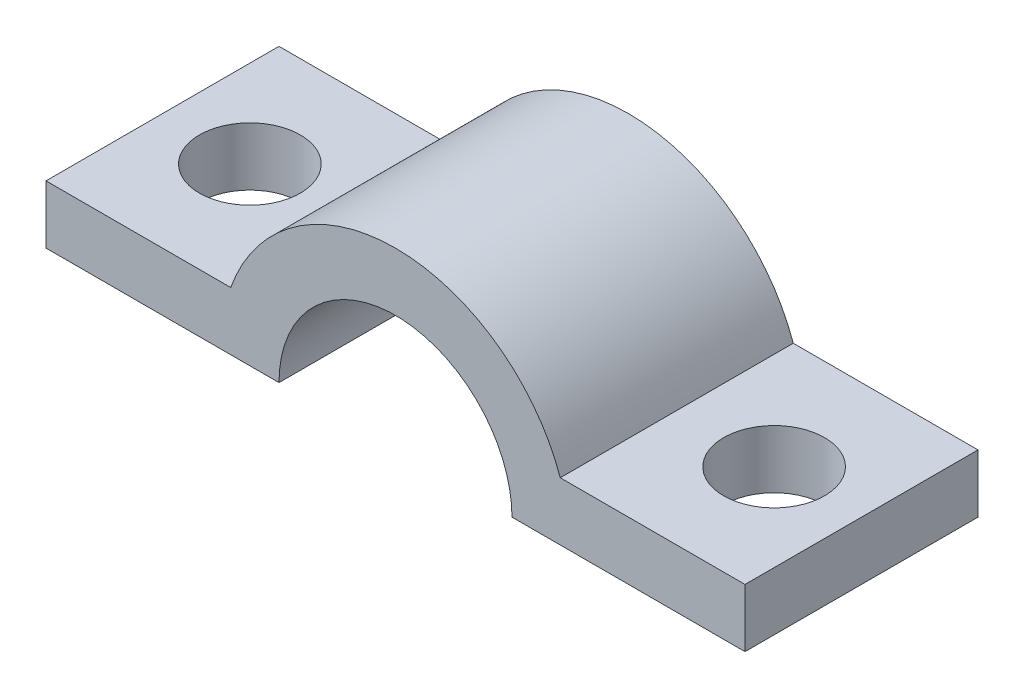
ISO-10303-21;
HEADER;
FILE_DESCRIPTION(('STEP AP214'),'2;1');
FILE_NAME('part.step','',(''),(''),'','','');
FILE_SCHEMA(('AUTOMOTIVE_DESIGN { 1 0 10303 214 1 1 1 1 }'));
ENDSEC;
DATA;
#1=APPLICATION_CONTEXT('core data for automotive mechanical design processes');
#2=APPLICATION_PROTOCOL_DEFINITION('international standard','automotive_design',2000,#1);
#3=PRODUCT_CONTEXT('',#1,'mechanical');
#4=PRODUCT('Part','Part','',(#3));
#5=PRODUCT_RELATED_PRODUCT_CATEGORY('part','',(#4));
#6=PRODUCT_DEFINITION_FORMATION('','',#4);
#7=PRODUCT_DEFINITION_CONTEXT('part definition',#1,'design');
#8=PRODUCT_DEFINITION('design','',#6,#7);
#9=PRODUCT_DEFINITION_SHAPE('','',#8);
#10=(LENGTH_UNIT() NAMED_UNIT(*) SI_UNIT(.MILLI.,.METRE.));
#11=(NAMED_UNIT(*) PLANE_ANGLE_UNIT() SI_UNIT($,.RADIAN.));
#12=(NAMED_UNIT(*) SI_UNIT($,.STERADIAN.) SOLID_ANGLE_UNIT());
#13=UNCERTAINTY_MEASURE_WITH_UNIT(LENGTH_MEASURE(1.E-05),#10,'distance_accuracy_value','');
#14=(GEOMETRIC_REPRESENTATION_CONTEXT(3) GLOBAL_UNCERTAINTY_ASSIGNED_CONTEXT((#13)) GLOBAL_UNIT_ASSIGNED_CONTEXT((#10,
#11,#12)) REPRESENTATION_CONTEXT('',''));
#15=CARTESIAN_POINT('',(0.,0.,0.));
#16=DIRECTION('',(0.,0.,1.));
#17=DIRECTION('',(1.,0.,0.));
#18=AXIS2_PLACEMENT_3D('',#15,#16,#17);
#19=CARTESIAN_POINT('',(0.,0.,12.7));
#20=DIRECTION('',(1.,0.,0.));
#21=DIRECTION('',(0.,0.,-1.));
#22=AXIS2_PLACEMENT_3D('',#19,#20,#21);
#23=PLANE('',#22);
#24=DIRECTION('',(0.,-1.,0.));
#25=VECTOR('',#24,1.);
#26=CARTESIAN_POINT('',(0.,0.,0.));
#27=LINE('',#26,#25);
#28=CARTESIAN_POINT('',(0.,3.175,0.));
#29=VERTEX_POINT('',#28);
#30=CARTESIAN_POINT('',(0.,0.,0.));
#31=VERTEX_POINT('',#30);
#32=EDGE_CURVE('E129',#29,#31,#27,.T.);
#33=ORIENTED_EDGE('',*,*,#32,.T.);
#34=DIRECTION('',(0.,0.,-1.));
#35=VECTOR('',#34,1.);
#36=CARTESIAN_POINT('',(0.,0.,12.7));
#37=LINE('',#36,#35);
#38=CARTESIAN_POINT('',(0.,0.,12.7));
#39=VERTEX_POINT('',#38);
#40=EDGE_CURVE('E11',#39,#31,#37,.T.);
#41=ORIENTED_EDGE('',*,*,#40,.F.);
#42=DIRECTION('',(0.,-1.,0.));
#43=VECTOR('',#42,1.);
#44=CARTESIAN_POINT('',(0.,0.,12.7));
#45=LINE('',#44,#43);
#46=CARTESIAN_POINT('',(0.,3.175,12.7));
#47=VERTEX_POINT('',#46);
#48=EDGE_CURVE('E144',#47,#39,#45,.T.);
#49=ORIENTED_EDGE('',*,*,#48,.F.);
#50=DIRECTION('',(0.,0.,-1.));
#51=VECTOR('',#50,1.);
#52=CARTESIAN_POINT('',(0.,3.175,12.7));
#53=LINE('',#52,#51);
#54=EDGE_CURVE('E125',#47,#29,#53,.T.);
#55=ORIENTED_EDGE('',*,*,#54,.T.);
#56=EDGE_LOOP('',(#33,#41,#49,#55));
#57=FACE_BOUND('',#56,.T.);
#58=ADVANCED_FACE('F33',(#57),#23,.F.);
#59=CARTESIAN_POINT('',(0.,0.,12.7));
#60=DIRECTION('',(0.,1.,0.));
#61=DIRECTION('',(0.,0.,1.));
#62=AXIS2_PLACEMENT_3D('',#59,#60,#61);
#63=PLANE('',#62);
#64=CARTESIAN_POINT('',(4.7625,0.,6.35));
#65=DIRECTION('',(0.,1.,0.));
#66=DIRECTION('',(0.,0.,1.));
#67=AXIS2_PLACEMENT_3D('',#64,#65,#66);
#68=CIRCLE('',#67,2.74999999999999);
#69=CARTESIAN_POINT('',(4.7625,0.,9.09999999999999));
#70=VERTEX_POINT('',#69);
#71=EDGE_CURVE('E182',#70,#70,#68,.T.);
#72=ORIENTED_EDGE('',*,*,#71,.T.);
#73=EDGE_LOOP('',(#72));
#74=FACE_BOUND('',#73,.T.);
#75=DIRECTION('',(1.,0.,0.));
#76=VECTOR('',#75,1.);
#77=CARTESIAN_POINT('',(0.,0.,0.));
#78=LINE('',#77,#76);
#79=CARTESIAN_POINT('',(12.7,0.,0.));
#80=VERTEX_POINT('',#79);
#81=EDGE_CURVE('E132',#31,#80,#78,.T.);
#82=ORIENTED_EDGE('',*,*,#81,.T.);
#83=DIRECTION('',(0.,0.,-1.));
#84=VECTOR('',#83,1.);
#85=CARTESIAN_POINT('',(12.7,0.,12.7));
#86=LINE('',#85,#84);
#87=CARTESIAN_POINT('',(12.7,0.,12.7));
#88=VERTEX_POINT('',#87);
#89=EDGE_CURVE('E41',#88,#80,#86,.T.);
#90=ORIENTED_EDGE('',*,*,#89,.F.);
#91=DIRECTION('',(1.,0.,0.));
#92=VECTOR('',#91,1.);
#93=CARTESIAN_POINT('',(0.,0.,12.7));
#94=LINE('',#93,#92);
#95=EDGE_CURVE('E92',#39,#88,#94,.T.);
#96=ORIENTED_EDGE('',*,*,#95,.F.);
#97=ORIENTED_EDGE('',*,*,#40,.T.);
#98=EDGE_LOOP('',(#82,#90,#96,#97));
#99=FACE_BOUND('',#98,.T.);
#100=ADVANCED_FACE('F202',(#74,#99),#63,.F.);
#101=CARTESIAN_POINT('',(19.05,0.,12.7));
#102=DIRECTION('',(0.,0.,-1.));
#103=DIRECTION('',(-1.,0.,0.));
#104=AXIS2_PLACEMENT_3D('',#101,#102,#103);
#105=CYLINDRICAL_SURFACE('',#104,6.35);
#106=CARTESIAN_POINT('',(19.05,0.,0.));
#107=DIRECTION('',(0.,0.,-1.));
#108=DIRECTION('',(-1.,0.,0.));
#109=AXIS2_PLACEMENT_3D('',#106,#107,#108);
#110=CIRCLE('',#109,6.35);
#111=CARTESIAN_POINT('',(25.4,0.,0.));
#112=VERTEX_POINT('',#111);
#113=EDGE_CURVE('E135',#80,#112,#110,.T.);
#114=ORIENTED_EDGE('',*,*,#113,.T.);
#115=DIRECTION('',(0.,0.,-1.));
#116=VECTOR('',#115,1.);
#117=CARTESIAN_POINT('',(25.4,0.,12.7));
#118=LINE('',#117,#116);
#119=CARTESIAN_POINT('',(25.4,0.,12.7));
#120=VERTEX_POINT('',#119);
#121=EDGE_CURVE('E151',#120,#112,#118,.T.);
#122=ORIENTED_EDGE('',*,*,#121,.F.);
#123=CARTESIAN_POINT('',(19.05,0.,12.7));
#124=DIRECTION('',(0.,0.,-1.));
#125=DIRECTION('',(-1.,0.,0.));
#126=AXIS2_PLACEMENT_3D('',#123,#124,#125);
#127=CIRCLE('',#126,6.35);
#128=EDGE_CURVE('E159',#88,#120,#127,.T.);
#129=ORIENTED_EDGE('',*,*,#128,.F.);
#130=ORIENTED_EDGE('',*,*,#89,.T.);
#131=EDGE_LOOP('',(#114,#122,#129,#130));
#132=FACE_BOUND('',#131,.T.);
#133=ADVANCED_FACE('F157',(#132),#105,.F.);
#134=CARTESIAN_POINT('',(25.4,0.,12.7));
#135=DIRECTION('',(0.,1.,0.));
#136=DIRECTION('',(0.,0.,1.));
#137=AXIS2_PLACEMENT_3D('',#134,#135,#136);
#138=PLANE('',#137);
#139=CARTESIAN_POINT('',(33.3375,0.,6.35));
#140=DIRECTION('',(0.,1.,0.));
#141=DIRECTION('',(0.,0.,1.));
#142=AXIS2_PLACEMENT_3D('',#139,#140,#141);
#143=CIRCLE('',#142,2.75);
#144=CARTESIAN_POINT('',(33.3375,0.,9.1));
#145=VERTEX_POINT('',#144);
#146=EDGE_CURVE('E133',#145,#145,#143,.T.);
#147=ORIENTED_EDGE('',*,*,#146,.T.);
#148=EDGE_LOOP('',(#147));
#149=FACE_BOUND('',#148,.T.);
#150=DIRECTION('',(1.,0.,0.));
#151=VECTOR('',#150,1.);
#152=CARTESIAN_POINT('',(25.4,0.,0.));
#153=LINE('',#152,#151);
#154=CARTESIAN_POINT('',(38.1,0.,0.));
#155=VERTEX_POINT('',#154);
#156=EDGE_CURVE('E137',#112,#155,#153,.T.);
#157=ORIENTED_EDGE('',*,*,#156,.T.);
#158=DIRECTION('',(0.,0.,-1.));
#159=VECTOR('',#158,1.);
#160=CARTESIAN_POINT('',(38.1,0.,12.7));
#161=LINE('',#160,#159);
#162=CARTESIAN_POINT('',(38.1,0.,12.7));
#163=VERTEX_POINT('',#162);
#164=EDGE_CURVE('E148',#163,#155,#161,.T.);
#165=ORIENTED_EDGE('',*,*,#164,.F.);
#166=DIRECTION('',(1.,0.,0.));
#167=VECTOR('',#166,1.);
#168=CARTESIAN_POINT('',(25.4,0.,12.7));
#169=LINE('',#168,#167);
#170=EDGE_CURVE('E171',#120,#163,#169,.T.);
#171=ORIENTED_EDGE('',*,*,#170,.F.);
#172=ORIENTED_EDGE('',*,*,#121,.T.);
#173=EDGE_LOOP('',(#157,#165,#171,#172));
#174=FACE_BOUND('',#173,.T.);
#175=ADVANCED_FACE('F167',(#149,#174),#138,.F.);
#176=CARTESIAN_POINT('',(38.1,0.,12.7));
#177=DIRECTION('',(-1.,0.,0.));
#178=DIRECTION('',(0.,0.,1.));
#179=AXIS2_PLACEMENT_3D('',#176,#177,#178);
#180=PLANE('',#179);
#181=DIRECTION('',(0.,1.,0.));
#182=VECTOR('',#181,1.);
#183=CARTESIAN_POINT('',(38.1,0.,0.));
#184=LINE('',#183,#182);
#185=CARTESIAN_POINT('',(38.1,3.175,0.));
#186=VERTEX_POINT('',#185);
#187=EDGE_CURVE('E139',#155,#186,#184,.T.);
#188=ORIENTED_EDGE('',*,*,#187,.T.);
#189=DIRECTION('',(0.,0.,-1.));
#190=VECTOR('',#189,1.);
#191=CARTESIAN_POINT('',(38.1,3.175,12.7));
#192=LINE('',#191,#190);
#193=CARTESIAN_POINT('',(38.1,3.175,12.7));
#194=VERTEX_POINT('',#193);
#195=EDGE_CURVE('E120',#194,#186,#192,.T.);
#196=ORIENTED_EDGE('',*,*,#195,.F.);
#197=DIRECTION('',(0.,1.,0.));
#198=VECTOR('',#197,1.);
#199=CARTESIAN_POINT('',(38.1,0.,12.7));
#200=LINE('',#199,#198);
#201=EDGE_CURVE('E111',#163,#194,#200,.T.);
#202=ORIENTED_EDGE('',*,*,#201,.F.);
#203=ORIENTED_EDGE('',*,*,#164,.T.);
#204=EDGE_LOOP('',(#188,#196,#202,#203));
#205=FACE_BOUND('',#204,.T.);
#206=ADVANCED_FACE('F170',(#205),#180,.F.);
#207=CARTESIAN_POINT('',(28.0302561210692,3.175,12.7));
#208=DIRECTION('',(0.,-1.,0.));
#209=DIRECTION('',(0.,0.,-1.));
#210=AXIS2_PLACEMENT_3D('',#207,#208,#209);
#211=PLANE('',#210);
#212=CARTESIAN_POINT('',(33.3375,3.175,6.35));
#213=DIRECTION('',(0.,1.,0.));
#214=DIRECTION('',(0.,0.,1.));
#215=AXIS2_PLACEMENT_3D('',#212,#213,#214);
#216=CIRCLE('',#215,2.74999999999999);
#217=CARTESIAN_POINT('',(33.3375,3.175,9.09999999999999));
#218=VERTEX_POINT('',#217);
#219=EDGE_CURVE('E179',#218,#218,#216,.T.);
#220=ORIENTED_EDGE('',*,*,#219,.F.);
#221=EDGE_LOOP('',(#220));
#222=FACE_BOUND('',#221,.T.);
#223=DIRECTION('',(-1.,0.,0.));
#224=VECTOR('',#223,1.);
#225=CARTESIAN_POINT('',(28.0302561210692,3.175,0.));
#226=LINE('',#225,#224);
#227=CARTESIAN_POINT('',(28.0302561210692,3.175,0.));
#228=VERTEX_POINT('',#227);
#229=EDGE_CURVE('E119',#186,#228,#226,.T.);
#230=ORIENTED_EDGE('',*,*,#229,.T.);
#231=DIRECTION('',(0.,0.,-1.));
#232=VECTOR('',#231,1.);
#233=CARTESIAN_POINT('',(28.0302561210692,3.175,12.7));
#234=LINE('',#233,#232);
#235=CARTESIAN_POINT('',(28.0302561210692,3.175,12.7));
#236=VERTEX_POINT('',#235);
#237=EDGE_CURVE('E116',#236,#228,#234,.T.);
#238=ORIENTED_EDGE('',*,*,#237,.F.);
#239=DIRECTION('',(-1.,0.,0.));
#240=VECTOR('',#239,1.);
#241=CARTESIAN_POINT('',(28.0302561210692,3.175,12.7));
#242=LINE('',#241,#240);
#243=EDGE_CURVE('E105',#194,#236,#242,.T.);
#244=ORIENTED_EDGE('',*,*,#243,.F.);
#245=ORIENTED_EDGE('',*,*,#195,.T.);
#246=EDGE_LOOP('',(#230,#238,#244,#245));
#247=FACE_BOUND('',#246,.T.);
#248=ADVANCED_FACE('F117',(#222,#247),#211,.F.);
#249=CARTESIAN_POINT('',(19.05,0.,12.7));
#250=DIRECTION('',(0.,0.,-1.));
#251=DIRECTION('',(-1.,0.,0.));
#252=AXIS2_PLACEMENT_3D('',#249,#250,#251);
#253=CYLINDRICAL_SURFACE('',#252,9.525);
#254=CARTESIAN_POINT('',(19.05,0.,0.));
#255=DIRECTION('',(0.,0.,1.));
#256=DIRECTION('',(1.,0.,0.));
#257=AXIS2_PLACEMENT_3D('',#254,#255,#256);
#258=CIRCLE('',#257,9.525);
#259=CARTESIAN_POINT('',(10.0697438789308,3.175,0.));
#260=VERTEX_POINT('',#259);
#261=EDGE_CURVE('E78',#228,#260,#258,.T.);
#262=ORIENTED_EDGE('',*,*,#261,.T.);
#263=DIRECTION('',(0.,0.,-1.));
#264=VECTOR('',#263,1.);
#265=CARTESIAN_POINT('',(10.0697438789308,3.175,12.7));
#266=LINE('',#265,#264);
#267=CARTESIAN_POINT('',(10.0697438789308,3.175,12.7));
#268=VERTEX_POINT('',#267);
#269=EDGE_CURVE('E121',#268,#260,#266,.T.);
#270=ORIENTED_EDGE('',*,*,#269,.F.);
#271=CARTESIAN_POINT('',(19.05,0.,12.7));
#272=DIRECTION('',(0.,0.,1.));
#273=DIRECTION('',(1.,0.,0.));
#274=AXIS2_PLACEMENT_3D('',#271,#272,#273);
#275=CIRCLE('',#274,9.525);
#276=EDGE_CURVE('E109',#236,#268,#275,.T.);
#277=ORIENTED_EDGE('',*,*,#276,.F.);
#278=ORIENTED_EDGE('',*,*,#237,.T.);
#279=EDGE_LOOP('',(#262,#270,#277,#278));
#280=FACE_BOUND('',#279,.T.);
#281=ADVANCED_FACE('F123',(#280),#253,.T.);
#282=CARTESIAN_POINT('',(0.,3.175,12.7));
#283=DIRECTION('',(0.,-1.,0.));
#284=DIRECTION('',(0.,0.,-1.));
#285=AXIS2_PLACEMENT_3D('',#282,#283,#284);
#286=PLANE('',#285);
#287=CARTESIAN_POINT('',(4.7625,3.175,6.35));
#288=DIRECTION('',(0.,1.,0.));
#289=DIRECTION('',(0.,0.,1.));
#290=AXIS2_PLACEMENT_3D('',#287,#288,#289);
#291=CIRCLE('',#290,2.74999999999999);
#292=CARTESIAN_POINT('',(4.7625,3.175,9.09999999999999));
#293=VERTEX_POINT('',#292);
#294=EDGE_CURVE('E185',#293,#293,#291,.T.);
#295=ORIENTED_EDGE('',*,*,#294,.F.);
#296=EDGE_LOOP('',(#295));
#297=FACE_BOUND('',#296,.T.);
#298=DIRECTION('',(-1.,0.,0.));
#299=VECTOR('',#298,1.);
#300=CARTESIAN_POINT('',(0.,3.175,0.));
#301=LINE('',#300,#299);
#302=EDGE_CURVE('E84',#260,#29,#301,.T.);
#303=ORIENTED_EDGE('',*,*,#302,.T.);
#304=ORIENTED_EDGE('',*,*,#54,.F.);
#305=DIRECTION('',(-1.,0.,0.));
#306=VECTOR('',#305,1.);
#307=CARTESIAN_POINT('',(0.,3.175,12.7));
#308=LINE('',#307,#306);
#309=EDGE_CURVE('E49',#268,#47,#308,.T.);
#310=ORIENTED_EDGE('',*,*,#309,.F.);
#311=ORIENTED_EDGE('',*,*,#269,.T.);
#312=EDGE_LOOP('',(#303,#304,#310,#311));
#313=FACE_BOUND('',#312,.T.);
#314=ADVANCED_FACE('F191',(#297,#313),#286,.F.);
#315=CARTESIAN_POINT('',(19.05,0.,12.7));
#316=DIRECTION('',(0.,0.,1.));
#317=DIRECTION('',(1.,0.,0.));
#318=AXIS2_PLACEMENT_3D('',#315,#316,#317);
#319=PLANE('',#318);
#320=ORIENTED_EDGE('',*,*,#48,.T.);
#321=ORIENTED_EDGE('',*,*,#95,.T.);
#322=ORIENTED_EDGE('',*,*,#128,.T.);
#323=ORIENTED_EDGE('',*,*,#170,.T.);
#324=ORIENTED_EDGE('',*,*,#201,.T.);
#325=ORIENTED_EDGE('',*,*,#243,.T.);
#326=ORIENTED_EDGE('',*,*,#276,.T.);
#327=ORIENTED_EDGE('',*,*,#309,.T.);
#328=EDGE_LOOP('',(#320,#321,#322,#323,#324,#325,#326,#327));
#329=FACE_BOUND('',#328,.T.);
#330=ADVANCED_FACE('F107',(#329),#319,.T.);
#331=CARTESIAN_POINT('',(19.05,0.,0.));
#332=DIRECTION('',(0.,0.,1.));
#333=DIRECTION('',(1.,0.,0.));
#334=AXIS2_PLACEMENT_3D('',#331,#332,#333);
#335=PLANE('',#334);
#336=ORIENTED_EDGE('',*,*,#32,.F.);
#337=ORIENTED_EDGE('',*,*,#302,.F.);
#338=ORIENTED_EDGE('',*,*,#261,.F.);
#339=ORIENTED_EDGE('',*,*,#229,.F.);
#340=ORIENTED_EDGE('',*,*,#187,.F.);
#341=ORIENTED_EDGE('',*,*,#156,.F.);
#342=ORIENTED_EDGE('',*,*,#113,.F.);
#343=ORIENTED_EDGE('',*,*,#81,.F.);
#344=EDGE_LOOP('',(#336,#337,#338,#339,#340,#341,#342,#343));
#345=FACE_BOUND('',#344,.T.);
#346=ADVANCED_FACE('F163',(#345),#335,.F.);
#347=CARTESIAN_POINT('',(33.3375,3.175,6.35));
#348=DIRECTION('',(0.,1.,0.));
#349=DIRECTION('',(0.,0.,1.));
#350=AXIS2_PLACEMENT_3D('',#347,#348,#349);
#351=CYLINDRICAL_SURFACE('',#350,2.74999999999999);
#352=ORIENTED_EDGE('',*,*,#146,.F.);
#353=EDGE_LOOP('',(#352));
#354=FACE_BOUND('',#353,.T.);
#355=ORIENTED_EDGE('',*,*,#219,.T.);
#356=EDGE_LOOP('',(#355));
#357=FACE_BOUND('',#356,.T.);
#358=ADVANCED_FACE('F226',(#354,#357),#351,.F.);
#359=CARTESIAN_POINT('',(4.7625,3.175,6.35));
#360=DIRECTION('',(0.,1.,0.));
#361=DIRECTION('',(0.,0.,1.));
#362=AXIS2_PLACEMENT_3D('',#359,#360,#361);
#363=CYLINDRICAL_SURFACE('',#362,2.74999999999999);
#364=ORIENTED_EDGE('',*,*,#71,.F.);
#365=EDGE_LOOP('',(#364));
#366=FACE_BOUND('',#365,.T.);
#367=ORIENTED_EDGE('',*,*,#294,.T.);
#368=EDGE_LOOP('',(#367));
#369=FACE_BOUND('',#368,.T.);
#370=ADVANCED_FACE('F189',(#366,#369),#363,.F.);
#371=CLOSED_SHELL('',(#58,#100,#133,#175,#206,#248,#281,#314,#330,#346,#358,#370));
#372=MANIFOLD_SOLID_BREP('B2',#371);
#373=ADVANCED_BREP_SHAPE_REPRESENTATION('',(#18,#372),#14);
#374=SHAPE_DEFINITION_REPRESENTATION(#9,#373);
ENDSEC;
END-ISO-10303-21;
